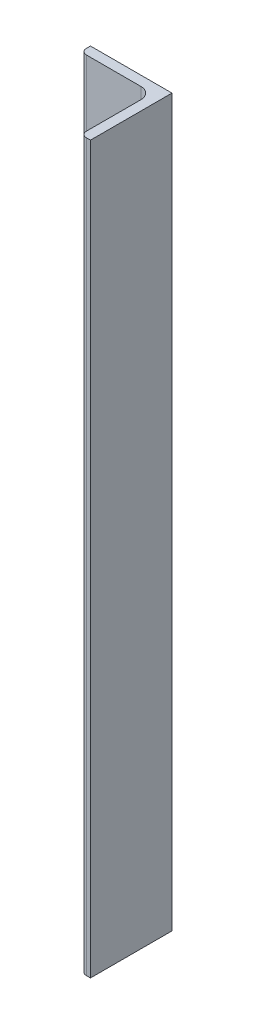
ISO-10303-21;
HEADER;
FILE_DESCRIPTION(('STEP AP214'),'2;1');
FILE_NAME('part.step','',(''),(''),'','','');
FILE_SCHEMA(('AUTOMOTIVE_DESIGN { 1 0 10303 214 1 1 1 1 }'));
ENDSEC;
DATA;
#1=APPLICATION_CONTEXT('core data for automotive mechanical design processes');
#2=APPLICATION_PROTOCOL_DEFINITION('international standard','automotive_design',2000,#1);
#3=PRODUCT_CONTEXT('',#1,'mechanical');
#4=PRODUCT('Part','Part','',(#3));
#5=PRODUCT_RELATED_PRODUCT_CATEGORY('part','',(#4));
#6=PRODUCT_DEFINITION_FORMATION('','',#4);
#7=PRODUCT_DEFINITION_CONTEXT('part definition',#1,'design');
#8=PRODUCT_DEFINITION('design','',#6,#7);
#9=PRODUCT_DEFINITION_SHAPE('','',#8);
#10=(LENGTH_UNIT() NAMED_UNIT(*) SI_UNIT(.MILLI.,.METRE.));
#11=(NAMED_UNIT(*) PLANE_ANGLE_UNIT() SI_UNIT($,.RADIAN.));
#12=(NAMED_UNIT(*) SI_UNIT($,.STERADIAN.) SOLID_ANGLE_UNIT());
#13=UNCERTAINTY_MEASURE_WITH_UNIT(LENGTH_MEASURE(1.E-05),#10,'distance_accuracy_value','');
#14=(GEOMETRIC_REPRESENTATION_CONTEXT(3) GLOBAL_UNCERTAINTY_ASSIGNED_CONTEXT((#13)) GLOBAL_UNIT_ASSIGNED_CONTEXT((#10,
#11,#12)) REPRESENTATION_CONTEXT('',''));
#15=CARTESIAN_POINT('',(0.,0.,0.));
#16=DIRECTION('',(0.,0.,1.));
#17=DIRECTION('',(1.,0.,0.));
#18=AXIS2_PLACEMENT_3D('',#15,#16,#17);
#19=CARTESIAN_POINT('',(0.,222.5,0.));
#20=DIRECTION('',(-1.,0.,0.));
#21=DIRECTION('',(0.,0.,1.));
#22=AXIS2_PLACEMENT_3D('',#19,#20,#21);
#23=PLANE('',#22);
#24=DIRECTION('',(0.,0.,-1.));
#25=VECTOR('',#24,1.);
#26=CARTESIAN_POINT('',(0.,-222.5,0.));
#27=LINE('',#26,#25);
#28=CARTESIAN_POINT('',(0.,-222.5,50.));
#29=VERTEX_POINT('',#28);
#30=CARTESIAN_POINT('',(0.,-222.5,0.));
#31=VERTEX_POINT('',#30);
#32=EDGE_CURVE('E135',#29,#31,#27,.T.);
#33=ORIENTED_EDGE('',*,*,#32,.T.);
#34=DIRECTION('',(0.,-1.,0.));
#35=VECTOR('',#34,1.);
#36=CARTESIAN_POINT('',(0.,222.5,0.));
#37=LINE('',#36,#35);
#38=CARTESIAN_POINT('',(0.,222.5,0.));
#39=VERTEX_POINT('',#38);
#40=EDGE_CURVE('E11',#39,#31,#37,.T.);
#41=ORIENTED_EDGE('',*,*,#40,.F.);
#42=DIRECTION('',(0.,0.,-1.));
#43=VECTOR('',#42,1.);
#44=CARTESIAN_POINT('',(0.,222.5,0.));
#45=LINE('',#44,#43);
#46=CARTESIAN_POINT('',(0.,222.5,50.));
#47=VERTEX_POINT('',#46);
#48=EDGE_CURVE('E151',#47,#39,#45,.T.);
#49=ORIENTED_EDGE('',*,*,#48,.F.);
#50=DIRECTION('',(0.,-1.,0.));
#51=VECTOR('',#50,1.);
#52=CARTESIAN_POINT('',(0.,222.5,50.));
#53=LINE('',#52,#51);
#54=EDGE_CURVE('E131',#47,#29,#53,.T.);
#55=ORIENTED_EDGE('',*,*,#54,.T.);
#56=EDGE_LOOP('',(#33,#41,#49,#55));
#57=FACE_BOUND('',#56,.T.);
#58=ADVANCED_FACE('F33',(#57),#23,.F.);
#59=CARTESIAN_POINT('',(0.,222.5,0.));
#60=DIRECTION('',(0.,0.,1.));
#61=DIRECTION('',(1.,0.,0.));
#62=AXIS2_PLACEMENT_3D('',#59,#60,#61);
#63=PLANE('',#62);
#64=DIRECTION('',(-1.,0.,0.));
#65=VECTOR('',#64,1.);
#66=CARTESIAN_POINT('',(0.,-222.5,0.));
#67=LINE('',#66,#65);
#68=CARTESIAN_POINT('',(-50.,-222.5,0.));
#69=VERTEX_POINT('',#68);
#70=EDGE_CURVE('E138',#31,#69,#67,.T.);
#71=ORIENTED_EDGE('',*,*,#70,.T.);
#72=DIRECTION('',(0.,-1.,0.));
#73=VECTOR('',#72,1.);
#74=CARTESIAN_POINT('',(-50.,222.5,0.));
#75=LINE('',#74,#73);
#76=CARTESIAN_POINT('',(-50.,222.5,0.));
#77=VERTEX_POINT('',#76);
#78=EDGE_CURVE('E41',#77,#69,#75,.T.);
#79=ORIENTED_EDGE('',*,*,#78,.F.);
#80=DIRECTION('',(-1.,0.,0.));
#81=VECTOR('',#80,1.);
#82=CARTESIAN_POINT('',(0.,222.5,0.));
#83=LINE('',#82,#81);
#84=EDGE_CURVE('E95',#39,#77,#83,.T.);
#85=ORIENTED_EDGE('',*,*,#84,.F.);
#86=ORIENTED_EDGE('',*,*,#40,.T.);
#87=EDGE_LOOP('',(#71,#79,#85,#86));
#88=FACE_BOUND('',#87,.T.);
#89=ADVANCED_FACE('F194',(#88),#63,.F.);
#90=CARTESIAN_POINT('',(-50.,222.5,0.));
#91=DIRECTION('',(1.,0.,0.));
#92=DIRECTION('',(0.,0.,-1.));
#93=AXIS2_PLACEMENT_3D('',#90,#91,#92);
#94=PLANE('',#93);
#95=DIRECTION('',(0.,0.,1.));
#96=VECTOR('',#95,1.);
#97=CARTESIAN_POINT('',(-50.,-222.5,0.));
#98=LINE('',#97,#96);
#99=CARTESIAN_POINT('',(-50.,-222.5,2.50000000000001));
#100=VERTEX_POINT('',#99);
#101=EDGE_CURVE('E140',#69,#100,#98,.T.);
#102=ORIENTED_EDGE('',*,*,#101,.T.);
#103=DIRECTION('',(0.,-1.,0.));
#104=VECTOR('',#103,1.);
#105=CARTESIAN_POINT('',(-50.,222.5,2.50000000000001));
#106=LINE('',#105,#104);
#107=CARTESIAN_POINT('',(-50.,222.5,2.50000000000001));
#108=VERTEX_POINT('',#107);
#109=EDGE_CURVE('E161',#108,#100,#106,.T.);
#110=ORIENTED_EDGE('',*,*,#109,.F.);
#111=DIRECTION('',(0.,0.,1.));
#112=VECTOR('',#111,1.);
#113=CARTESIAN_POINT('',(-50.,222.5,0.));
#114=LINE('',#113,#112);
#115=EDGE_CURVE('E169',#77,#108,#114,.T.);
#116=ORIENTED_EDGE('',*,*,#115,.F.);
#117=ORIENTED_EDGE('',*,*,#78,.T.);
#118=EDGE_LOOP('',(#102,#110,#116,#117));
#119=FACE_BOUND('',#118,.T.);
#120=ADVANCED_FACE('F167',(#119),#94,.F.);
#121=CARTESIAN_POINT('',(-46.5,222.5,2.50000000000001));
#122=DIRECTION('',(0.,-1.,0.));
#123=DIRECTION('',(0.,0.,-1.));
#124=AXIS2_PLACEMENT_3D('',#121,#122,#123);
#125=CYLINDRICAL_SURFACE('',#124,3.5);
#126=CARTESIAN_POINT('',(-46.5,-222.5,2.50000000000001));
#127=DIRECTION('',(0.,1.,0.));
#128=DIRECTION('',(0.,0.,1.));
#129=AXIS2_PLACEMENT_3D('',#126,#127,#128);
#130=CIRCLE('',#129,3.5);
#131=CARTESIAN_POINT('',(-46.5,-222.5,6.00000000000001));
#132=VERTEX_POINT('',#131);
#133=EDGE_CURVE('E142',#100,#132,#130,.T.);
#134=ORIENTED_EDGE('',*,*,#133,.T.);
#135=DIRECTION('',(0.,-1.,0.));
#136=VECTOR('',#135,1.);
#137=CARTESIAN_POINT('',(-46.5,222.5,6.00000000000001));
#138=LINE('',#137,#136);
#139=CARTESIAN_POINT('',(-46.5,222.5,6.00000000000001));
#140=VERTEX_POINT('',#139);
#141=EDGE_CURVE('E158',#140,#132,#138,.T.);
#142=ORIENTED_EDGE('',*,*,#141,.F.);
#143=CARTESIAN_POINT('',(-46.5,222.5,2.50000000000001));
#144=DIRECTION('',(0.,1.,0.));
#145=DIRECTION('',(0.,0.,1.));
#146=AXIS2_PLACEMENT_3D('',#143,#144,#145);
#147=CIRCLE('',#146,3.5);
#148=EDGE_CURVE('E185',#108,#140,#147,.T.);
#149=ORIENTED_EDGE('',*,*,#148,.F.);
#150=ORIENTED_EDGE('',*,*,#109,.T.);
#151=EDGE_LOOP('',(#134,#142,#149,#150));
#152=FACE_BOUND('',#151,.T.);
#153=ADVANCED_FACE('F178',(#152),#125,.T.);
#154=CARTESIAN_POINT('',(-46.5,222.5,6.00000000000001));
#155=DIRECTION('',(0.,0.,-1.));
#156=DIRECTION('',(-1.,0.,0.));
#157=AXIS2_PLACEMENT_3D('',#154,#155,#156);
#158=PLANE('',#157);
#159=DIRECTION('',(1.,0.,0.));
#160=VECTOR('',#159,1.);
#161=CARTESIAN_POINT('',(-46.5,-222.5,6.00000000000001));
#162=LINE('',#161,#160);
#163=CARTESIAN_POINT('',(-13.,-222.5,6.00000000000001));
#164=VERTEX_POINT('',#163);
#165=EDGE_CURVE('E144',#132,#164,#162,.T.);
#166=ORIENTED_EDGE('',*,*,#165,.T.);
#167=DIRECTION('',(0.,-1.,0.));
#168=VECTOR('',#167,1.);
#169=CARTESIAN_POINT('',(-13.,222.5,6.00000000000001));
#170=LINE('',#169,#168);
#171=CARTESIAN_POINT('',(-13.,222.5,6.00000000000001));
#172=VERTEX_POINT('',#171);
#173=EDGE_CURVE('E155',#172,#164,#170,.T.);
#174=ORIENTED_EDGE('',*,*,#173,.F.);
#175=DIRECTION('',(1.,0.,0.));
#176=VECTOR('',#175,1.);
#177=CARTESIAN_POINT('',(-46.5,222.5,6.00000000000001));
#178=LINE('',#177,#176);
#179=EDGE_CURVE('E184',#140,#172,#178,.T.);
#180=ORIENTED_EDGE('',*,*,#179,.F.);
#181=ORIENTED_EDGE('',*,*,#141,.T.);
#182=EDGE_LOOP('',(#166,#174,#180,#181));
#183=FACE_BOUND('',#182,.T.);
#184=ADVANCED_FACE('F182',(#183),#158,.F.);
#185=CARTESIAN_POINT('',(-13.,222.5,13.));
#186=DIRECTION('',(0.,-1.,0.));
#187=DIRECTION('',(0.,0.,-1.));
#188=AXIS2_PLACEMENT_3D('',#185,#186,#187);
#189=CYLINDRICAL_SURFACE('',#188,7.);
#190=CARTESIAN_POINT('',(-13.,-222.5,13.));
#191=DIRECTION('',(0.,-1.,0.));
#192=DIRECTION('',(0.,0.,-1.));
#193=AXIS2_PLACEMENT_3D('',#190,#191,#192);
#194=CIRCLE('',#193,7.);
#195=CARTESIAN_POINT('',(-6.,-222.5,13.));
#196=VERTEX_POINT('',#195);
#197=EDGE_CURVE('E146',#164,#196,#194,.T.);
#198=ORIENTED_EDGE('',*,*,#197,.T.);
#199=DIRECTION('',(0.,-1.,0.));
#200=VECTOR('',#199,1.);
#201=CARTESIAN_POINT('',(-6.,222.5,13.));
#202=LINE('',#201,#200);
#203=CARTESIAN_POINT('',(-6.,222.5,13.));
#204=VERTEX_POINT('',#203);
#205=EDGE_CURVE('E126',#204,#196,#202,.T.);
#206=ORIENTED_EDGE('',*,*,#205,.F.);
#207=CARTESIAN_POINT('',(-13.,222.5,13.));
#208=DIRECTION('',(0.,-1.,0.));
#209=DIRECTION('',(0.,0.,-1.));
#210=AXIS2_PLACEMENT_3D('',#207,#208,#209);
#211=CIRCLE('',#210,7.);
#212=EDGE_CURVE('E117',#172,#204,#211,.T.);
#213=ORIENTED_EDGE('',*,*,#212,.F.);
#214=ORIENTED_EDGE('',*,*,#173,.T.);
#215=EDGE_LOOP('',(#198,#206,#213,#214));
#216=FACE_BOUND('',#215,.T.);
#217=ADVANCED_FACE('F206',(#216),#189,.F.);
#218=CARTESIAN_POINT('',(-6.,222.5,46.5));
#219=DIRECTION('',(1.,0.,0.));
#220=DIRECTION('',(0.,0.,-1.));
#221=AXIS2_PLACEMENT_3D('',#218,#219,#220);
#222=PLANE('',#221);
#223=DIRECTION('',(0.,0.,1.));
#224=VECTOR('',#223,1.);
#225=CARTESIAN_POINT('',(-6.,-222.5,46.5));
#226=LINE('',#225,#224);
#227=CARTESIAN_POINT('',(-6.,-222.5,46.5));
#228=VERTEX_POINT('',#227);
#229=EDGE_CURVE('E125',#196,#228,#226,.T.);
#230=ORIENTED_EDGE('',*,*,#229,.T.);
#231=DIRECTION('',(0.,-1.,0.));
#232=VECTOR('',#231,1.);
#233=CARTESIAN_POINT('',(-6.,222.5,46.5));
#234=LINE('',#233,#232);
#235=CARTESIAN_POINT('',(-6.,222.5,46.5));
#236=VERTEX_POINT('',#235);
#237=EDGE_CURVE('E122',#236,#228,#234,.T.);
#238=ORIENTED_EDGE('',*,*,#237,.F.);
#239=DIRECTION('',(0.,0.,1.));
#240=VECTOR('',#239,1.);
#241=CARTESIAN_POINT('',(-6.,222.5,46.5));
#242=LINE('',#241,#240);
#243=EDGE_CURVE('E111',#204,#236,#242,.T.);
#244=ORIENTED_EDGE('',*,*,#243,.F.);
#245=ORIENTED_EDGE('',*,*,#205,.T.);
#246=EDGE_LOOP('',(#230,#238,#244,#245));
#247=FACE_BOUND('',#246,.T.);
#248=ADVANCED_FACE('F123',(#247),#222,.F.);
#249=CARTESIAN_POINT('',(-2.49999999999999,222.5,46.5));
#250=DIRECTION('',(0.,-1.,0.));
#251=DIRECTION('',(0.,0.,-1.));
#252=AXIS2_PLACEMENT_3D('',#249,#250,#251);
#253=CYLINDRICAL_SURFACE('',#252,3.5);
#254=CARTESIAN_POINT('',(-2.49999999999999,-222.5,46.5));
#255=DIRECTION('',(0.,1.,0.));
#256=DIRECTION('',(0.,0.,-1.));
#257=AXIS2_PLACEMENT_3D('',#254,#255,#256);
#258=CIRCLE('',#257,3.5);
#259=CARTESIAN_POINT('',(-2.49999999999999,-222.5,50.));
#260=VERTEX_POINT('',#259);
#261=EDGE_CURVE('E81',#228,#260,#258,.T.);
#262=ORIENTED_EDGE('',*,*,#261,.T.);
#263=DIRECTION('',(0.,-1.,0.));
#264=VECTOR('',#263,1.);
#265=CARTESIAN_POINT('',(-2.49999999999999,222.5,50.));
#266=LINE('',#265,#264);
#267=CARTESIAN_POINT('',(-2.49999999999999,222.5,50.));
#268=VERTEX_POINT('',#267);
#269=EDGE_CURVE('E127',#268,#260,#266,.T.);
#270=ORIENTED_EDGE('',*,*,#269,.F.);
#271=CARTESIAN_POINT('',(-2.49999999999999,222.5,46.5));
#272=DIRECTION('',(0.,1.,0.));
#273=DIRECTION('',(0.,0.,-1.));
#274=AXIS2_PLACEMENT_3D('',#271,#272,#273);
#275=CIRCLE('',#274,3.5);
#276=EDGE_CURVE('E115',#236,#268,#275,.T.);
#277=ORIENTED_EDGE('',*,*,#276,.F.);
#278=ORIENTED_EDGE('',*,*,#237,.T.);
#279=EDGE_LOOP('',(#262,#270,#277,#278));
#280=FACE_BOUND('',#279,.T.);
#281=ADVANCED_FACE('F129',(#280),#253,.T.);
#282=CARTESIAN_POINT('',(0.,222.5,50.));
#283=DIRECTION('',(0.,0.,-1.));
#284=DIRECTION('',(-1.,0.,0.));
#285=AXIS2_PLACEMENT_3D('',#282,#283,#284);
#286=PLANE('',#285);
#287=DIRECTION('',(1.,0.,0.));
#288=VECTOR('',#287,1.);
#289=CARTESIAN_POINT('',(0.,-222.5,50.));
#290=LINE('',#289,#288);
#291=EDGE_CURVE('E87',#260,#29,#290,.T.);
#292=ORIENTED_EDGE('',*,*,#291,.T.);
#293=ORIENTED_EDGE('',*,*,#54,.F.);
#294=DIRECTION('',(1.,0.,0.));
#295=VECTOR('',#294,1.);
#296=CARTESIAN_POINT('',(0.,222.5,50.));
#297=LINE('',#296,#295);
#298=EDGE_CURVE('E49',#268,#47,#297,.T.);
#299=ORIENTED_EDGE('',*,*,#298,.F.);
#300=ORIENTED_EDGE('',*,*,#269,.T.);
#301=EDGE_LOOP('',(#292,#293,#299,#300));
#302=FACE_BOUND('',#301,.T.);
#303=ADVANCED_FACE('F214',(#302),#286,.F.);
#304=CARTESIAN_POINT('',(-2.49999999999999,222.5,46.5));
#305=DIRECTION('',(0.,-1.,0.));
#306=DIRECTION('',(0.,0.,-1.));
#307=AXIS2_PLACEMENT_3D('',#304,#305,#306);
#308=PLANE('',#307);
#309=ORIENTED_EDGE('',*,*,#48,.T.);
#310=ORIENTED_EDGE('',*,*,#84,.T.);
#311=ORIENTED_EDGE('',*,*,#115,.T.);
#312=ORIENTED_EDGE('',*,*,#148,.T.);
#313=ORIENTED_EDGE('',*,*,#179,.T.);
#314=ORIENTED_EDGE('',*,*,#212,.T.);
#315=ORIENTED_EDGE('',*,*,#243,.T.);
#316=ORIENTED_EDGE('',*,*,#276,.T.);
#317=ORIENTED_EDGE('',*,*,#298,.T.);
#318=EDGE_LOOP('',(#309,#310,#311,#312,#313,#314,#315,#316,#317));
#319=FACE_BOUND('',#318,.T.);
#320=ADVANCED_FACE('F113',(#319),#308,.F.);
#321=CARTESIAN_POINT('',(-2.49999999999999,-222.5,46.5));
#322=DIRECTION('',(0.,-1.,0.));
#323=DIRECTION('',(0.,0.,-1.));
#324=AXIS2_PLACEMENT_3D('',#321,#322,#323);
#325=PLANE('',#324);
#326=ORIENTED_EDGE('',*,*,#32,.F.);
#327=ORIENTED_EDGE('',*,*,#291,.F.);
#328=ORIENTED_EDGE('',*,*,#261,.F.);
#329=ORIENTED_EDGE('',*,*,#229,.F.);
#330=ORIENTED_EDGE('',*,*,#197,.F.);
#331=ORIENTED_EDGE('',*,*,#165,.F.);
#332=ORIENTED_EDGE('',*,*,#133,.F.);
#333=ORIENTED_EDGE('',*,*,#101,.F.);
#334=ORIENTED_EDGE('',*,*,#70,.F.);
#335=EDGE_LOOP('',(#326,#327,#328,#329,#330,#331,#332,#333,#334));
#336=FACE_BOUND('',#335,.T.);
#337=ADVANCED_FACE('F173',(#336),#325,.T.);
#338=CLOSED_SHELL('',(#58,#89,#120,#153,#184,#217,#248,#281,#303,#320,#337));
#339=MANIFOLD_SOLID_BREP('B2',#338);
#340=ADVANCED_BREP_SHAPE_REPRESENTATION('',(#18,#339),#14);
#341=SHAPE_DEFINITION_REPRESENTATION(#9,#340);
ENDSEC;
END-ISO-10303-21;
